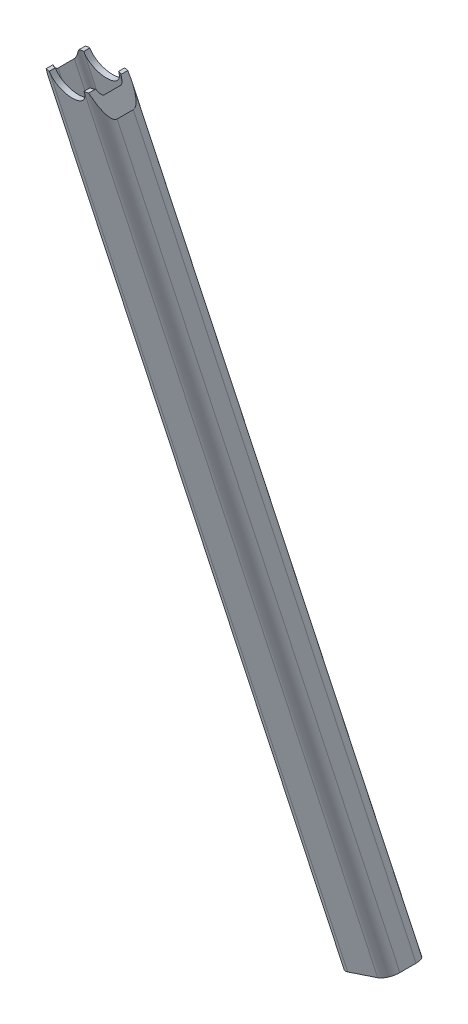
ISO-10303-21;
HEADER;
FILE_DESCRIPTION(('STEP AP214'),'2;1');
FILE_NAME('part.step','',(''),(''),'','','');
FILE_SCHEMA(('AUTOMOTIVE_DESIGN { 1 0 10303 214 1 1 1 1 }'));
ENDSEC;
DATA;
#1=APPLICATION_CONTEXT('core data for automotive mechanical design processes');
#2=APPLICATION_PROTOCOL_DEFINITION('international standard','automotive_design',2000,#1);
#3=PRODUCT_CONTEXT('',#1,'mechanical');
#4=PRODUCT('Part','Part','',(#3));
#5=PRODUCT_RELATED_PRODUCT_CATEGORY('part','',(#4));
#6=PRODUCT_DEFINITION_FORMATION('','',#4);
#7=PRODUCT_DEFINITION_CONTEXT('part definition',#1,'design');
#8=PRODUCT_DEFINITION('design','',#6,#7);
#9=PRODUCT_DEFINITION_SHAPE('','',#8);
#10=(LENGTH_UNIT() NAMED_UNIT(*) SI_UNIT(.MILLI.,.METRE.));
#11=(NAMED_UNIT(*) PLANE_ANGLE_UNIT() SI_UNIT($,.RADIAN.));
#12=(NAMED_UNIT(*) SI_UNIT($,.STERADIAN.) SOLID_ANGLE_UNIT());
#13=UNCERTAINTY_MEASURE_WITH_UNIT(LENGTH_MEASURE(1.E-05),#10,'distance_accuracy_value','');
#14=(GEOMETRIC_REPRESENTATION_CONTEXT(3) GLOBAL_UNCERTAINTY_ASSIGNED_CONTEXT((#13)) GLOBAL_UNIT_ASSIGNED_CONTEXT((#10,
#11,#12)) REPRESENTATION_CONTEXT('',''));
#15=CARTESIAN_POINT('',(0.,0.,0.));
#16=DIRECTION('',(0.,0.,1.));
#17=DIRECTION('',(1.,0.,0.));
#18=AXIS2_PLACEMENT_3D('',#15,#16,#17);
#19=CARTESIAN_POINT('',(0.,3.057033245491,-9.52126817897499));
#20=DIRECTION('',(0.,-0.305703324549102,0.952126817897504));
#21=DIRECTION('',(0.,0.952126817897504,0.305703324549102));
#22=AXIS2_PLACEMENT_3D('',#19,#20,#21);
#23=PLANE('',#22);
#24=DIRECTION('',(-1.,0.,0.));
#25=VECTOR('',#24,1.);
#26=CARTESIAN_POINT('',(0.,-12.4494519813525,-14.5));
#27=LINE('',#26,#25);
#28=CARTESIAN_POINT('',(9.00000000000001,-12.4494519813525,-14.5));
#29=VERTEX_POINT('',#28);
#30=CARTESIAN_POINT('',(-9.,-12.4494519813525,-14.5));
#31=VERTEX_POINT('',#30);
#32=EDGE_CURVE('E210',#29,#31,#27,.T.);
#33=ORIENTED_EDGE('',*,*,#32,.T.);
#34=DIRECTION('',(0.,0.952126817897504,0.305703324549102));
#35=VECTOR('',#34,1.);
#36=CARTESIAN_POINT('',(-9.,-483.960112896616,-165.889892493982));
#37=LINE('',#36,#35);
#38=CARTESIAN_POINT('',(-9.,0.,-10.5028025805239));
#39=VERTEX_POINT('',#38);
#40=EDGE_CURVE('E344',#39,#31,#37,.F.);
#41=ORIENTED_EDGE('',*,*,#40,.F.);
#42=CARTESIAN_POINT('',(0.,0.,-10.5028025805239));
#43=DIRECTION('',(0.,0.305703324549102,-0.952126817897504));
#44=DIRECTION('',(0.,-0.952126817897504,-0.305703324549102));
#45=AXIS2_PLACEMENT_3D('',#42,#43,#44);
#46=ELLIPSE('',#45,9.45252232247159,9.);
#47=CARTESIAN_POINT('',(9.,0.,-10.5028025805239));
#48=VERTEX_POINT('',#47);
#49=EDGE_CURVE('E293',#48,#39,#46,.T.);
#50=ORIENTED_EDGE('',*,*,#49,.F.);
#51=DIRECTION('',(0.,-0.952126817897504,-0.305703324549102));
#52=VECTOR('',#51,1.);
#53=CARTESIAN_POINT('',(9.,0.,-10.5028025805239));
#54=LINE('',#53,#52);
#55=EDGE_CURVE('E350',#29,#48,#54,.F.);
#56=ORIENTED_EDGE('',*,*,#55,.F.);
#57=EDGE_LOOP('',(#33,#41,#50,#56));
#58=FACE_BOUND('',#57,.T.);
#59=ADVANCED_FACE('F43',(#58),#23,.F.);
#60=DIRECTION('',(1.,0.,0.));
#61=VECTOR('',#60,1.);
#62=CARTESIAN_POINT('',(0.,-16.5,-15.8005263293399));
#63=LINE('',#62,#61);
#64=CARTESIAN_POINT('',(-9.,-16.5,-15.8005263293399));
#65=VERTEX_POINT('',#64);
#66=CARTESIAN_POINT('',(9.00000000000001,-16.5,-15.8005263293399));
#67=VERTEX_POINT('',#66);
#68=EDGE_CURVE('E203',#65,#67,#63,.T.);
#69=ORIENTED_EDGE('',*,*,#68,.T.);
#70=CARTESIAN_POINT('',(9.00000000000001,-473.772717307585,-162.618982945461));
#71=VERTEX_POINT('',#70);
#72=EDGE_CURVE('E212',#71,#67,#54,.F.);
#73=ORIENTED_EDGE('',*,*,#72,.F.);
#74=DIRECTION('',(0.913345512368731,0.387692168498585,0.124477939896055));
#75=VECTOR('',#74,1.);
#76=CARTESIAN_POINT('',(187.742025958265,-397.901228690018,-138.258607969261));
#77=LINE('',#76,#75);
#78=CARTESIAN_POINT('',(-9.00000000000004,-481.413263999358,-165.072165106852));
#79=VERTEX_POINT('',#78);
#80=EDGE_CURVE('E299',#79,#71,#77,.T.);
#81=ORIENTED_EDGE('',*,*,#80,.F.);
#82=EDGE_CURVE('E341',#65,#79,#37,.F.);
#83=ORIENTED_EDGE('',*,*,#82,.F.);
#84=EDGE_LOOP('',(#69,#73,#81,#83));
#85=FACE_BOUND('',#84,.T.);
#86=ADVANCED_FACE('F451',(#85),#23,.F.);
#87=CARTESIAN_POINT('',(9.,20.2653496561465,2.30555921939207));
#88=DIRECTION('',(0.,0.952126817897504,0.305703324549102));
#89=DIRECTION('',(0.,0.305703324549102,-0.952126817897504));
#90=AXIS2_PLACEMENT_3D('',#87,#88,#89);
#91=CYLINDRICAL_SURFACE('',#90,6.);
#92=ORIENTED_EDGE('',*,*,#55,.T.);
#93=CARTESIAN_POINT('',(9.,0.,-4.20112103220954));
#94=DIRECTION('',(0.,-1.,0.));
#95=DIRECTION('',(0.,0.,1.));
#96=AXIS2_PLACEMENT_3D('',#93,#94,#95);
#97=ELLIPSE('',#96,6.30168154831439,6.);
#98=CARTESIAN_POINT('',(10.980762113533,0.,-10.1495083750219));
#99=VERTEX_POINT('',#98);
#100=EDGE_CURVE('E312',#48,#99,#97,.T.);
#101=ORIENTED_EDGE('',*,*,#100,.T.);
#102=CARTESIAN_POINT('',(9.,7.39230484541259,-1.8276429147532));
#103=DIRECTION('',(0.965925826289066,0.258819045102528,0.));
#104=DIRECTION('',(-0.245605956195242,0.916613907162153,0.315430910784522));
#105=AXIS2_PLACEMENT_3D('',#102,#103,#104);
#106=ELLIPSE('',#105,24.347827826264,6.);
#107=CARTESIAN_POINT('',(15.,-14.9999999999999,-9.0172335311331));
#108=VERTEX_POINT('',#107);
#109=EDGE_CURVE('E371',#108,#99,#106,.T.);
#110=ORIENTED_EDGE('',*,*,#109,.F.);
#111=DIRECTION('',(0.,-0.952126817897504,-0.305703324549102));
#112=VECTOR('',#111,1.);
#113=CARTESIAN_POINT('',(15.,-473.060088357622,-156.088494650946));
#114=LINE('',#113,#112);
#115=CARTESIAN_POINT('',(15.,-471.225868410328,-155.499574010017));
#116=VERTEX_POINT('',#115);
#117=EDGE_CURVE('E340',#108,#116,#114,.T.);
#118=ORIENTED_EDGE('',*,*,#117,.T.);
#119=CARTESIAN_POINT('',(9.,-473.772717307585,-156.317301397147));
#120=DIRECTION('',(0.390731128489275,-0.92050485345244,0.));
#121=DIRECTION('',(0.711194291827604,0.301884066312843,0.634876909155039));
#122=AXIS2_PLACEMENT_3D('',#119,#120,#121);
#123=ELLIPSE('',#122,6.84589714511482,6.);
#124=EDGE_CURVE('E333',#116,#71,#123,.F.);
#125=ORIENTED_EDGE('',*,*,#124,.T.);
#126=ORIENTED_EDGE('',*,*,#72,.T.);
#127=CARTESIAN_POINT('',(9.,-16.5,-9.49884478102551));
#128=DIRECTION('',(0.,-1.,0.));
#129=DIRECTION('',(0.,0.,1.));
#130=AXIS2_PLACEMENT_3D('',#127,#128,#129);
#131=ELLIPSE('',#130,6.30168154831439,6.);
#132=CARTESIAN_POINT('',(12.6504642541504,-16.5,-14.5));
#133=VERTEX_POINT('',#132);
#134=EDGE_CURVE('E196',#133,#67,#131,.F.);
#135=ORIENTED_EDGE('',*,*,#134,.F.);
#136=CARTESIAN_POINT('',(9.,-32.0763239129866,-14.5));
#137=DIRECTION('',(0.,0.,1.));
#138=DIRECTION('',(0.,1.,0.));
#139=AXIS2_PLACEMENT_3D('',#136,#137,#138);
#140=ELLIPSE('',#139,19.6268719316341,6.);
#141=EDGE_CURVE('E202',#29,#133,#140,.F.);
#142=ORIENTED_EDGE('',*,*,#141,.F.);
#143=EDGE_LOOP('',(#92,#101,#110,#118,#125,#126,#135,#142));
#144=FACE_BOUND('',#143,.T.);
#145=ADVANCED_FACE('F211',(#144),#91,.T.);
#146=CARTESIAN_POINT('',(-9.,20.2653496561465,2.30555921939207));
#147=DIRECTION('',(0.,-0.952126817897504,-0.305703324549102));
#148=DIRECTION('',(0.,-0.305703324549102,0.952126817897504));
#149=AXIS2_PLACEMENT_3D('',#146,#147,#148);
#150=CYLINDRICAL_SURFACE('',#149,6.);
#151=CARTESIAN_POINT('',(-9.,-16.5,-9.49884478102551));
#152=DIRECTION('',(0.,-1.,0.));
#153=DIRECTION('',(0.,0.,-1.));
#154=AXIS2_PLACEMENT_3D('',#151,#152,#153);
#155=ELLIPSE('',#154,6.30168154831439,6.);
#156=CARTESIAN_POINT('',(-12.6504642541504,-16.5,-14.5));
#157=VERTEX_POINT('',#156);
#158=EDGE_CURVE('E51',#65,#157,#155,.F.);
#159=ORIENTED_EDGE('',*,*,#158,.F.);
#160=ORIENTED_EDGE('',*,*,#82,.T.);
#161=CARTESIAN_POINT('',(-9.,-481.413263999358,-158.770483558537));
#162=DIRECTION('',(0.390731128489275,-0.92050485345244,0.));
#163=DIRECTION('',(-0.711194291827604,-0.301884066312843,-0.634876909155039));
#164=AXIS2_PLACEMENT_3D('',#161,#162,#163);
#165=ELLIPSE('',#164,6.84589714511482,6.);
#166=CARTESIAN_POINT('',(-15.,-483.960112896616,-159.588210945667));
#167=VERTEX_POINT('',#166);
#168=EDGE_CURVE('E329',#79,#167,#165,.F.);
#169=ORIENTED_EDGE('',*,*,#168,.T.);
#170=DIRECTION('',(0.,0.952126817897504,0.305703324549102));
#171=VECTOR('',#170,1.);
#172=CARTESIAN_POINT('',(-15.,-1.83421994729463,-4.79004167313892));
#173=LINE('',#172,#171);
#174=CARTESIAN_POINT('',(-15.,-15.,-9.01723353113316));
#175=VERTEX_POINT('',#174);
#176=EDGE_CURVE('E325',#167,#175,#173,.T.);
#177=ORIENTED_EDGE('',*,*,#176,.T.);
#178=CARTESIAN_POINT('',(-9.,7.39230484541259,-1.8276429147532));
#179=DIRECTION('',(-0.965925826289066,0.258819045102528,0.));
#180=DIRECTION('',(-0.245605956195242,-0.916613907162153,-0.315430910784522));
#181=AXIS2_PLACEMENT_3D('',#178,#179,#180);
#182=ELLIPSE('',#181,24.347827826264,6.);
#183=CARTESIAN_POINT('',(-10.980762113533,0.,-10.1495083750219));
#184=VERTEX_POINT('',#183);
#185=EDGE_CURVE('E366',#184,#175,#182,.T.);
#186=ORIENTED_EDGE('',*,*,#185,.F.);
#187=CARTESIAN_POINT('',(-9.,0.,-4.20112103220954));
#188=DIRECTION('',(0.,-1.,0.));
#189=DIRECTION('',(0.,0.,-1.));
#190=AXIS2_PLACEMENT_3D('',#187,#188,#189);
#191=ELLIPSE('',#190,6.30168154831439,6.);
#192=EDGE_CURVE('E309',#184,#39,#191,.T.);
#193=ORIENTED_EDGE('',*,*,#192,.T.);
#194=ORIENTED_EDGE('',*,*,#40,.T.);
#195=CARTESIAN_POINT('',(-9.,-32.0763239129866,-14.5));
#196=DIRECTION('',(0.,0.,1.));
#197=DIRECTION('',(0.,-1.,0.));
#198=AXIS2_PLACEMENT_3D('',#195,#196,#197);
#199=ELLIPSE('',#198,19.6268719316341,6.);
#200=EDGE_CURVE('E11',#157,#31,#199,.F.);
#201=ORIENTED_EDGE('',*,*,#200,.F.);
#202=EDGE_LOOP('',(#159,#160,#169,#177,#186,#193,#194,#201));
#203=FACE_BOUND('',#202,.T.);
#204=ADVANCED_FACE('F448',(#203),#150,.T.);
#205=CARTESIAN_POINT('',(0.,0.,0.));
#206=DIRECTION('',(0.,1.,0.));
#207=DIRECTION('',(0.,0.,-1.));
#208=AXIS2_PLACEMENT_3D('',#205,#206,#207);
#209=PLANE('',#208);
#210=ORIENTED_EDGE('',*,*,#100,.F.);
#211=DIRECTION('',(0.,0.,-1.));
#212=VECTOR('',#211,1.);
#213=CARTESIAN_POINT('',(9.,0.,10.5028025805241));
#214=LINE('',#213,#212);
#215=CARTESIAN_POINT('',(9.00000000000001,0.,-7.35196180636674));
#216=VERTEX_POINT('',#215);
#217=EDGE_CURVE('E281',#48,#216,#214,.F.);
#218=ORIENTED_EDGE('',*,*,#217,.T.);
#219=CARTESIAN_POINT('',(9.,0.,-4.20112103220954));
#220=DIRECTION('',(0.,-1.,0.));
#221=DIRECTION('',(0.,0.,1.));
#222=AXIS2_PLACEMENT_3D('',#219,#220,#221);
#223=ELLIPSE('',#222,3.1508407741572,3.);
#224=CARTESIAN_POINT('',(10.980762113533,0.,-6.56753587915757));
#225=VERTEX_POINT('',#224);
#226=EDGE_CURVE('E250',#216,#225,#223,.T.);
#227=ORIENTED_EDGE('',*,*,#226,.T.);
#228=DIRECTION('',(0.,0.,1.));
#229=VECTOR('',#228,1.);
#230=CARTESIAN_POINT('',(10.980762113533,0.,0.));
#231=LINE('',#230,#229);
#232=EDGE_CURVE('E380',#99,#225,#231,.T.);
#233=ORIENTED_EDGE('',*,*,#232,.F.);
#234=EDGE_LOOP('',(#210,#218,#227,#233));
#235=FACE_BOUND('',#234,.T.);
#236=ADVANCED_FACE('F410',(#235),#209,.T.);
#237=CARTESIAN_POINT('',(-9.,0.,4.20112103220966));
#238=DIRECTION('',(0.,-1.,0.));
#239=DIRECTION('',(0.,0.,1.));
#240=AXIS2_PLACEMENT_3D('',#237,#238,#239);
#241=ELLIPSE('',#240,6.30168154831439,6.);
#242=CARTESIAN_POINT('',(-9.,0.,10.5028025805241));
#243=VERTEX_POINT('',#242);
#244=CARTESIAN_POINT('',(-10.980762113533,0.,10.149508375022));
#245=VERTEX_POINT('',#244);
#246=EDGE_CURVE('E316',#243,#245,#241,.T.);
#247=ORIENTED_EDGE('',*,*,#246,.F.);
#248=DIRECTION('',(0.,0.,-1.));
#249=VECTOR('',#248,1.);
#250=CARTESIAN_POINT('',(-9.,0.,10.5028025805241));
#251=LINE('',#250,#249);
#252=CARTESIAN_POINT('',(-9.00000000000002,0.,7.35196180636685));
#253=VERTEX_POINT('',#252);
#254=EDGE_CURVE('E286',#243,#253,#251,.T.);
#255=ORIENTED_EDGE('',*,*,#254,.T.);
#256=CARTESIAN_POINT('',(-9.,0.,4.20112103220966));
#257=DIRECTION('',(0.,-1.,0.));
#258=DIRECTION('',(0.,0.,1.));
#259=AXIS2_PLACEMENT_3D('',#256,#257,#258);
#260=ELLIPSE('',#259,3.1508407741572,3.);
#261=CARTESIAN_POINT('',(-10.980762113533,0.,6.56753587915769));
#262=VERTEX_POINT('',#261);
#263=EDGE_CURVE('E227',#253,#262,#260,.T.);
#264=ORIENTED_EDGE('',*,*,#263,.T.);
#265=DIRECTION('',(0.,0.,-1.));
#266=VECTOR('',#265,1.);
#267=CARTESIAN_POINT('',(-10.980762113533,0.,0.));
#268=LINE('',#267,#266);
#269=EDGE_CURVE('E358',#245,#262,#268,.T.);
#270=ORIENTED_EDGE('',*,*,#269,.F.);
#271=EDGE_LOOP('',(#247,#255,#264,#270));
#272=FACE_BOUND('',#271,.T.);
#273=ADVANCED_FACE('F440',(#272),#209,.T.);
#274=CARTESIAN_POINT('',(0.,0.,10.5028025805241));
#275=DIRECTION('',(0.,0.,-1.));
#276=DIRECTION('',(1.,0.,0.));
#277=AXIS2_PLACEMENT_3D('',#274,#275,#276);
#278=CYLINDRICAL_SURFACE('',#277,9.);
#279=CARTESIAN_POINT('',(0.,0.,7.35196180636685));
#280=DIRECTION('',(0.,0.305703324549102,-0.952126817897504));
#281=DIRECTION('',(0.,-0.952126817897504,-0.305703324549102));
#282=AXIS2_PLACEMENT_3D('',#279,#280,#281);
#283=ELLIPSE('',#282,9.45252232247159,9.);
#284=CARTESIAN_POINT('',(9.,0.,7.35196180636685));
#285=VERTEX_POINT('',#284);
#286=EDGE_CURVE('E213',#285,#253,#283,.T.);
#287=ORIENTED_EDGE('',*,*,#286,.T.);
#288=ORIENTED_EDGE('',*,*,#254,.F.);
#289=CARTESIAN_POINT('',(0.,0.,10.5028025805241));
#290=DIRECTION('',(0.,0.305703324549102,-0.952126817897504));
#291=DIRECTION('',(0.,-0.952126817897504,-0.305703324549102));
#292=AXIS2_PLACEMENT_3D('',#289,#290,#291);
#293=ELLIPSE('',#292,9.45252232247159,9.);
#294=CARTESIAN_POINT('',(9.,0.,10.5028025805241));
#295=VERTEX_POINT('',#294);
#296=EDGE_CURVE('E243',#295,#243,#293,.T.);
#297=ORIENTED_EDGE('',*,*,#296,.F.);
#298=EDGE_CURVE('E284',#285,#295,#214,.F.);
#299=ORIENTED_EDGE('',*,*,#298,.F.);
#300=EDGE_LOOP('',(#287,#288,#297,#299));
#301=FACE_BOUND('',#300,.T.);
#302=ADVANCED_FACE('F426',(#301),#278,.F.);
#303=CARTESIAN_POINT('',(-9.,0.,-4.20112103220954));
#304=DIRECTION('',(0.,-1.,0.));
#305=DIRECTION('',(0.,0.,-1.));
#306=AXIS2_PLACEMENT_3D('',#303,#304,#305);
#307=ELLIPSE('',#306,3.1508407741572,3.);
#308=CARTESIAN_POINT('',(-10.980762113533,0.,-6.56753587915757));
#309=VERTEX_POINT('',#308);
#310=CARTESIAN_POINT('',(-9.,0.,-7.35196180636674));
#311=VERTEX_POINT('',#310);
#312=EDGE_CURVE('E229',#309,#311,#307,.T.);
#313=ORIENTED_EDGE('',*,*,#312,.T.);
#314=EDGE_CURVE('E290',#311,#39,#251,.T.);
#315=ORIENTED_EDGE('',*,*,#314,.T.);
#316=ORIENTED_EDGE('',*,*,#192,.F.);
#317=DIRECTION('',(0.,0.,-1.));
#318=VECTOR('',#317,1.);
#319=CARTESIAN_POINT('',(-10.980762113533,0.,0.));
#320=LINE('',#319,#318);
#321=EDGE_CURVE('E352',#309,#184,#320,.T.);
#322=ORIENTED_EDGE('',*,*,#321,.F.);
#323=EDGE_LOOP('',(#313,#315,#316,#322));
#324=FACE_BOUND('',#323,.T.);
#325=ADVANCED_FACE('F496',(#324),#209,.T.);
#326=CARTESIAN_POINT('',(9.,0.,4.20112103220966));
#327=DIRECTION('',(0.,-1.,0.));
#328=DIRECTION('',(0.,0.,-1.));
#329=AXIS2_PLACEMENT_3D('',#326,#327,#328);
#330=ELLIPSE('',#329,3.1508407741572,3.);
#331=CARTESIAN_POINT('',(10.980762113533,0.,6.56753587915769));
#332=VERTEX_POINT('',#331);
#333=EDGE_CURVE('E251',#332,#285,#330,.T.);
#334=ORIENTED_EDGE('',*,*,#333,.T.);
#335=ORIENTED_EDGE('',*,*,#298,.T.);
#336=CARTESIAN_POINT('',(9.,0.,4.20112103220966));
#337=DIRECTION('',(0.,-1.,0.));
#338=DIRECTION('',(0.,0.,-1.));
#339=AXIS2_PLACEMENT_3D('',#336,#337,#338);
#340=ELLIPSE('',#339,6.30168154831439,6.);
#341=CARTESIAN_POINT('',(10.980762113533,0.,10.149508375022));
#342=VERTEX_POINT('',#341);
#343=EDGE_CURVE('E317',#342,#295,#340,.T.);
#344=ORIENTED_EDGE('',*,*,#343,.F.);
#345=DIRECTION('',(0.,0.,1.));
#346=VECTOR('',#345,1.);
#347=CARTESIAN_POINT('',(10.980762113533,0.,0.));
#348=LINE('',#347,#346);
#349=EDGE_CURVE('E372',#332,#342,#348,.T.);
#350=ORIENTED_EDGE('',*,*,#349,.F.);
#351=EDGE_LOOP('',(#334,#335,#344,#350));
#352=FACE_BOUND('',#351,.T.);
#353=ADVANCED_FACE('F418',(#352),#209,.T.);
#354=CARTESIAN_POINT('',(-15.,22.0995696034411,-3.40720168799301));
#355=DIRECTION('',(-1.,0.,0.));
#356=DIRECTION('',(0.,0.,-1.));
#357=AXIS2_PLACEMENT_3D('',#354,#355,#356);
#358=PLANE('',#357);
#359=ORIENTED_EDGE('',*,*,#176,.F.);
#360=DIRECTION('',(0.,0.,1.));
#361=VECTOR('',#360,1.);
#362=CARTESIAN_POINT('',(-15.,-483.960112896616,-3.40720168799301));
#363=LINE('',#362,#361);
#364=CARTESIAN_POINT('',(-15.,-483.960112896616,-151.185968881248));
#365=VERTEX_POINT('',#364);
#366=EDGE_CURVE('E298',#167,#365,#363,.T.);
#367=ORIENTED_EDGE('',*,*,#366,.T.);
#368=DIRECTION('',(0.,0.952126817897504,0.305703324549102));
#369=VECTOR('',#368,1.);
#370=CARTESIAN_POINT('',(-15.,17.8197230597537,9.92257376257209));
#371=LINE('',#370,#369);
#372=CARTESIAN_POINT('',(-15.,-15.,-0.614991466713979));
#373=VERTEX_POINT('',#372);
#374=EDGE_CURVE('E322',#373,#365,#371,.F.);
#375=ORIENTED_EDGE('',*,*,#374,.F.);
#376=DIRECTION('',(0.,0.,1.));
#377=VECTOR('',#376,1.);
#378=CARTESIAN_POINT('',(-15.,-15.,-3.40720168799301));
#379=LINE('',#378,#377);
#380=EDGE_CURVE('E346',#175,#373,#379,.T.);
#381=ORIENTED_EDGE('',*,*,#380,.F.);
#382=EDGE_LOOP('',(#359,#367,#375,#381));
#383=FACE_BOUND('',#382,.T.);
#384=ADVANCED_FACE('F447',(#383),#358,.T.);
#385=CARTESIAN_POINT('',(15.,22.0995696034411,-3.40720168799301));
#386=DIRECTION('',(1.,0.,0.));
#387=DIRECTION('',(0.,0.,1.));
#388=AXIS2_PLACEMENT_3D('',#385,#386,#387);
#389=PLANE('',#388);
#390=DIRECTION('',(0.,-0.952126817897504,-0.305703324549102));
#391=VECTOR('',#390,1.);
#392=CARTESIAN_POINT('',(15.,17.8197230597537,9.9225737625721));
#393=LINE('',#392,#391);
#394=CARTESIAN_POINT('',(15.,-471.225868410328,-147.097331945598));
#395=VERTEX_POINT('',#394);
#396=CARTESIAN_POINT('',(15.,-15.,-0.614991466713961));
#397=VERTEX_POINT('',#396);
#398=EDGE_CURVE('E338',#395,#397,#393,.F.);
#399=ORIENTED_EDGE('',*,*,#398,.F.);
#400=DIRECTION('',(0.,0.,-1.));
#401=VECTOR('',#400,1.);
#402=CARTESIAN_POINT('',(15.,-471.225868410328,-3.40720168799301));
#403=LINE('',#402,#401);
#404=EDGE_CURVE('E295',#395,#116,#403,.T.);
#405=ORIENTED_EDGE('',*,*,#404,.T.);
#406=ORIENTED_EDGE('',*,*,#117,.F.);
#407=DIRECTION('',(0.,0.,-1.));
#408=VECTOR('',#407,1.);
#409=CARTESIAN_POINT('',(15.,-15.,-3.40720168799301));
#410=LINE('',#409,#408);
#411=EDGE_CURVE('E367',#397,#108,#410,.T.);
#412=ORIENTED_EDGE('',*,*,#411,.F.);
#413=EDGE_LOOP('',(#399,#405,#406,#412));
#414=FACE_BOUND('',#413,.T.);
#415=ADVANCED_FACE('F391',(#414),#389,.T.);
#416=CARTESIAN_POINT('',(0.,-3.05703324549104,9.52126817897509));
#417=DIRECTION('',(0.,-0.305703324549102,0.952126817897504));
#418=DIRECTION('',(0.,0.952126817897504,0.305703324549102));
#419=AXIS2_PLACEMENT_3D('',#416,#417,#418);
#420=PLANE('',#419);
#421=ORIENTED_EDGE('',*,*,#296,.T.);
#422=DIRECTION('',(0.,0.952126817897504,0.305703324549102));
#423=VECTOR('',#422,1.);
#424=CARTESIAN_POINT('',(-9.,-3.05703324549104,9.52126817897509));
#425=LINE('',#424,#423);
#426=CARTESIAN_POINT('',(-9.00000000000004,-481.413263999358,-144.066559945804));
#427=VERTEX_POINT('',#426);
#428=EDGE_CURVE('E308',#427,#243,#425,.T.);
#429=ORIENTED_EDGE('',*,*,#428,.F.);
#430=DIRECTION('',(0.913345512368731,0.387692168498585,0.124477939896055));
#431=VECTOR('',#430,1.);
#432=CARTESIAN_POINT('',(185.353869976186,-398.914940761591,-117.57847956676));
#433=LINE('',#432,#431);
#434=CARTESIAN_POINT('',(8.99999999999998,-473.772717307585,-141.613377784413));
#435=VERTEX_POINT('',#434);
#436=EDGE_CURVE('E305',#427,#435,#433,.T.);
#437=ORIENTED_EDGE('',*,*,#436,.T.);
#438=DIRECTION('',(0.,-0.952126817897504,-0.305703324549102));
#439=VECTOR('',#438,1.);
#440=CARTESIAN_POINT('',(9.,-3.05703324549104,9.52126817897509));
#441=LINE('',#440,#439);
#442=EDGE_CURVE('E304',#295,#435,#441,.T.);
#443=ORIENTED_EDGE('',*,*,#442,.F.);
#444=EDGE_LOOP('',(#421,#429,#437,#443));
#445=FACE_BOUND('',#444,.T.);
#446=ADVANCED_FACE('F445',(#445),#420,.T.);
#447=CARTESIAN_POINT('',(171.775823269904,-404.678479641725,0.));
#448=DIRECTION('',(-0.390731128489275,0.92050485345244,0.));
#449=DIRECTION('',(-0.92050485345244,-0.390731128489275,0.));
#450=AXIS2_PLACEMENT_3D('',#447,#448,#449);
#451=PLANE('',#450);
#452=DIRECTION('',(0.,0.,1.));
#453=VECTOR('',#452,1.);
#454=CARTESIAN_POINT('',(-12.,-482.686688447987,-3.40720168799301));
#455=LINE('',#454,#453);
#456=CARTESIAN_POINT('',(-12.,-482.686688447987,-159.179347252102));
#457=VERTEX_POINT('',#456);
#458=CARTESIAN_POINT('',(-12.,-482.686688447987,-150.777105187683));
#459=VERTEX_POINT('',#458);
#460=EDGE_CURVE('E262',#457,#459,#455,.T.);
#461=ORIENTED_EDGE('',*,*,#460,.T.);
#462=CARTESIAN_POINT('',(-9.,-481.413263999358,-150.368241494118));
#463=DIRECTION('',(0.390731128489275,-0.92050485345244,0.));
#464=DIRECTION('',(0.711194291827604,0.301884066312843,0.634876909155039));
#465=AXIS2_PLACEMENT_3D('',#462,#463,#464);
#466=ELLIPSE('',#465,3.42294857255741,3.);
#467=CARTESIAN_POINT('',(-9.00000000000004,-481.413263999358,-147.217400719961));
#468=VERTEX_POINT('',#467);
#469=EDGE_CURVE('E239',#459,#468,#466,.F.);
#470=ORIENTED_EDGE('',*,*,#469,.T.);
#471=DIRECTION('',(0.913345512368731,0.387692168498585,0.124477939896055));
#472=VECTOR('',#471,1.);
#473=CARTESIAN_POINT('',(185.712093373498,-398.762883950855,-120.680498827136));
#474=LINE('',#473,#472);
#475=CARTESIAN_POINT('',(9.,-473.772717307585,-144.764218558571));
#476=VERTEX_POINT('',#475);
#477=EDGE_CURVE('E231',#468,#476,#474,.T.);
#478=ORIENTED_EDGE('',*,*,#477,.T.);
#479=CARTESIAN_POINT('',(9.,-473.772717307585,-147.915059332728));
#480=DIRECTION('',(0.390731128489275,-0.92050485345244,0.));
#481=DIRECTION('',(-0.711194291827604,-0.301884066312843,-0.634876909155039));
#482=AXIS2_PLACEMENT_3D('',#479,#480,#481);
#483=ELLIPSE('',#482,3.42294857255741,3.);
#484=CARTESIAN_POINT('',(12.,-472.499292858956,-147.506195639163));
#485=VERTEX_POINT('',#484);
#486=EDGE_CURVE('E270',#476,#485,#483,.F.);
#487=ORIENTED_EDGE('',*,*,#486,.T.);
#488=DIRECTION('',(0.,0.,-1.));
#489=VECTOR('',#488,1.);
#490=CARTESIAN_POINT('',(12.,-472.499292858956,-3.40720168799301));
#491=LINE('',#490,#489);
#492=CARTESIAN_POINT('',(12.,-472.499292858956,-155.908437703582));
#493=VERTEX_POINT('',#492);
#494=EDGE_CURVE('E252',#485,#493,#491,.T.);
#495=ORIENTED_EDGE('',*,*,#494,.T.);
#496=CARTESIAN_POINT('',(9.,-473.772717307585,-156.317301397147));
#497=DIRECTION('',(0.390731128489275,-0.92050485345244,0.));
#498=DIRECTION('',(0.711194291827604,0.301884066312843,0.634876909155039));
#499=AXIS2_PLACEMENT_3D('',#496,#497,#498);
#500=ELLIPSE('',#499,3.42294857255741,3.);
#501=CARTESIAN_POINT('',(9.00000000000001,-473.772717307585,-159.468142171304));
#502=VERTEX_POINT('',#501);
#503=EDGE_CURVE('E275',#493,#502,#500,.F.);
#504=ORIENTED_EDGE('',*,*,#503,.T.);
#505=DIRECTION('',(0.913345512368731,0.387692168498585,0.124477939896055));
#506=VECTOR('',#505,1.);
#507=CARTESIAN_POINT('',(187.383802560953,-398.053285500754,-135.156588708886));
#508=LINE('',#507,#506);
#509=CARTESIAN_POINT('',(-9.,-481.413263999358,-161.921324332695));
#510=VERTEX_POINT('',#509);
#511=EDGE_CURVE('E261',#510,#502,#508,.T.);
#512=ORIENTED_EDGE('',*,*,#511,.F.);
#513=CARTESIAN_POINT('',(-9.,-481.413263999358,-158.770483558537));
#514=DIRECTION('',(0.390731128489275,-0.92050485345244,0.));
#515=DIRECTION('',(-0.711194291827604,-0.301884066312843,-0.634876909155039));
#516=AXIS2_PLACEMENT_3D('',#513,#514,#515);
#517=ELLIPSE('',#516,3.42294857255741,3.);
#518=EDGE_CURVE('E221',#510,#457,#517,.F.);
#519=ORIENTED_EDGE('',*,*,#518,.T.);
#520=EDGE_LOOP('',(#461,#470,#478,#487,#495,#504,#512,#519));
#521=FACE_BOUND('',#520,.T.);
#522=ORIENTED_EDGE('',*,*,#366,.F.);
#523=ORIENTED_EDGE('',*,*,#168,.F.);
#524=ORIENTED_EDGE('',*,*,#80,.T.);
#525=ORIENTED_EDGE('',*,*,#124,.F.);
#526=ORIENTED_EDGE('',*,*,#404,.F.);
#527=CARTESIAN_POINT('',(9.,-473.772717307585,-147.915059332728));
#528=DIRECTION('',(0.390731128489275,-0.92050485345244,0.));
#529=DIRECTION('',(-0.711194291827604,-0.301884066312843,-0.634876909155039));
#530=AXIS2_PLACEMENT_3D('',#527,#528,#529);
#531=ELLIPSE('',#530,6.84589714511482,6.);
#532=EDGE_CURVE('E331',#435,#395,#531,.F.);
#533=ORIENTED_EDGE('',*,*,#532,.F.);
#534=ORIENTED_EDGE('',*,*,#436,.F.);
#535=CARTESIAN_POINT('',(-9.,-481.413263999358,-150.368241494118));
#536=DIRECTION('',(0.390731128489275,-0.92050485345244,0.));
#537=DIRECTION('',(0.711194291827604,0.301884066312843,0.634876909155039));
#538=AXIS2_PLACEMENT_3D('',#535,#536,#537);
#539=ELLIPSE('',#538,6.84589714511482,6.);
#540=EDGE_CURVE('E334',#365,#427,#539,.F.);
#541=ORIENTED_EDGE('',*,*,#540,.F.);
#542=EDGE_LOOP('',(#522,#523,#524,#525,#526,#533,#534,#541));
#543=FACE_BOUND('',#542,.T.);
#544=ADVANCED_FACE('F402',(#521,#543),#451,.F.);
#545=CARTESIAN_POINT('',(-9.,-1.22281329819642,3.80850727159007));
#546=DIRECTION('',(0.,0.952126817897504,0.305703324549102));
#547=DIRECTION('',(0.,0.305703324549102,-0.952126817897504));
#548=AXIS2_PLACEMENT_3D('',#545,#546,#547);
#549=CYLINDRICAL_SURFACE('',#548,6.);
#550=ORIENTED_EDGE('',*,*,#374,.T.);
#551=ORIENTED_EDGE('',*,*,#540,.T.);
#552=ORIENTED_EDGE('',*,*,#428,.T.);
#553=ORIENTED_EDGE('',*,*,#246,.T.);
#554=CARTESIAN_POINT('',(-9.,7.39230484541259,6.574599149666));
#555=DIRECTION('',(-0.965925826289066,0.258819045102528,0.));
#556=DIRECTION('',(0.245605956195242,0.916613907162153,0.315430910784522));
#557=AXIS2_PLACEMENT_3D('',#554,#555,#556);
#558=ELLIPSE('',#557,24.347827826264,6.);
#559=EDGE_CURVE('E355',#373,#245,#558,.T.);
#560=ORIENTED_EDGE('',*,*,#559,.F.);
#561=EDGE_LOOP('',(#550,#551,#552,#553,#560));
#562=FACE_BOUND('',#561,.T.);
#563=ADVANCED_FACE('F437',(#562),#549,.T.);
#564=CARTESIAN_POINT('',(9.,-1.22281329819642,3.80850727159007));
#565=DIRECTION('',(0.,-0.952126817897504,-0.305703324549102));
#566=DIRECTION('',(0.,-0.305703324549102,0.952126817897504));
#567=AXIS2_PLACEMENT_3D('',#564,#565,#566);
#568=CYLINDRICAL_SURFACE('',#567,6.);
#569=ORIENTED_EDGE('',*,*,#343,.T.);
#570=ORIENTED_EDGE('',*,*,#442,.T.);
#571=ORIENTED_EDGE('',*,*,#532,.T.);
#572=ORIENTED_EDGE('',*,*,#398,.T.);
#573=CARTESIAN_POINT('',(9.,7.39230484541259,6.574599149666));
#574=DIRECTION('',(0.965925826289066,0.258819045102528,0.));
#575=DIRECTION('',(0.245605956195242,-0.916613907162153,-0.315430910784522));
#576=AXIS2_PLACEMENT_3D('',#573,#574,#575);
#577=ELLIPSE('',#576,24.347827826264,6.);
#578=EDGE_CURVE('E383',#342,#397,#577,.T.);
#579=ORIENTED_EDGE('',*,*,#578,.F.);
#580=EDGE_LOOP('',(#569,#570,#571,#572,#579));
#581=FACE_BOUND('',#580,.T.);
#582=ADVANCED_FACE('F398',(#581),#568,.T.);
#583=ORIENTED_EDGE('',*,*,#217,.F.);
#584=ORIENTED_EDGE('',*,*,#49,.T.);
#585=ORIENTED_EDGE('',*,*,#314,.F.);
#586=CARTESIAN_POINT('',(0.,0.,-7.35196180636674));
#587=DIRECTION('',(0.,0.305703324549102,-0.952126817897504));
#588=DIRECTION('',(0.,-0.952126817897504,-0.305703324549102));
#589=AXIS2_PLACEMENT_3D('',#586,#587,#588);
#590=ELLIPSE('',#589,9.45252232247159,9.);
#591=EDGE_CURVE('E247',#216,#311,#590,.T.);
#592=ORIENTED_EDGE('',*,*,#591,.F.);
#593=EDGE_LOOP('',(#583,#584,#585,#592));
#594=FACE_BOUND('',#593,.T.);
#595=ADVANCED_FACE('F475',(#594),#278,.F.);
#596=CARTESIAN_POINT('',(-12.,22.0995696034411,-3.40720168799301));
#597=DIRECTION('',(-1.,0.,0.));
#598=DIRECTION('',(0.,0.,-1.));
#599=AXIS2_PLACEMENT_3D('',#596,#597,#598);
#600=PLANE('',#599);
#601=DIRECTION('',(0.,0.952126817897504,0.305703324549102));
#602=VECTOR('',#601,1.);
#603=CARTESIAN_POINT('',(-12.,-1.22281329819642,3.80850727159006));
#604=LINE('',#603,#602);
#605=CARTESIAN_POINT('',(-12.,-3.80384757729372,2.979803841476));
#606=VERTEX_POINT('',#605);
#607=EDGE_CURVE('E223',#606,#459,#604,.F.);
#608=ORIENTED_EDGE('',*,*,#607,.T.);
#609=ORIENTED_EDGE('',*,*,#460,.F.);
#610=DIRECTION('',(0.,-0.952126817897504,-0.305703324549102));
#611=VECTOR('',#610,1.);
#612=CARTESIAN_POINT('',(-12.,20.2653496561465,2.30555921939206));
#613=LINE('',#612,#611);
#614=CARTESIAN_POINT('',(-12.,-3.80384757729373,-5.42243822294319));
#615=VERTEX_POINT('',#614);
#616=EDGE_CURVE('E222',#457,#615,#613,.F.);
#617=ORIENTED_EDGE('',*,*,#616,.T.);
#618=DIRECTION('',(0.,0.,1.));
#619=VECTOR('',#618,1.);
#620=CARTESIAN_POINT('',(-12.,-3.80384757729372,-3.40720168799301));
#621=LINE('',#620,#619);
#622=EDGE_CURVE('E363',#606,#615,#621,.F.);
#623=ORIENTED_EDGE('',*,*,#622,.F.);
#624=EDGE_LOOP('',(#608,#609,#617,#623));
#625=FACE_BOUND('',#624,.T.);
#626=ADVANCED_FACE('F487',(#625),#600,.F.);
#627=CARTESIAN_POINT('',(12.,22.0995696034411,-3.40720168799301));
#628=DIRECTION('',(1.,0.,0.));
#629=DIRECTION('',(0.,0.,1.));
#630=AXIS2_PLACEMENT_3D('',#627,#628,#629);
#631=PLANE('',#630);
#632=DIRECTION('',(0.,0.952126817897504,0.305703324549102));
#633=VECTOR('',#632,1.);
#634=CARTESIAN_POINT('',(12.,20.2653496561465,2.30555921939208));
#635=LINE('',#634,#633);
#636=CARTESIAN_POINT('',(12.,-3.80384757729373,-5.42243822294317));
#637=VERTEX_POINT('',#636);
#638=EDGE_CURVE('E238',#637,#493,#635,.F.);
#639=ORIENTED_EDGE('',*,*,#638,.T.);
#640=ORIENTED_EDGE('',*,*,#494,.F.);
#641=DIRECTION('',(0.,-0.952126817897504,-0.305703324549102));
#642=VECTOR('',#641,1.);
#643=CARTESIAN_POINT('',(12.,-1.22281329819642,3.80850727159007));
#644=LINE('',#643,#642);
#645=CARTESIAN_POINT('',(12.,-3.80384757729372,2.97980384147602));
#646=VERTEX_POINT('',#645);
#647=EDGE_CURVE('E234',#485,#646,#644,.F.);
#648=ORIENTED_EDGE('',*,*,#647,.T.);
#649=DIRECTION('',(0.,0.,-1.));
#650=VECTOR('',#649,1.);
#651=CARTESIAN_POINT('',(12.,-3.80384757729372,-3.40720168799301));
#652=LINE('',#651,#650);
#653=EDGE_CURVE('E385',#637,#646,#652,.F.);
#654=ORIENTED_EDGE('',*,*,#653,.F.);
#655=EDGE_LOOP('',(#639,#640,#648,#654));
#656=FACE_BOUND('',#655,.T.);
#657=ADVANCED_FACE('F411',(#656),#631,.F.);
#658=CARTESIAN_POINT('',(0.,2.1399232718437,-6.66488772528248));
#659=DIRECTION('',(0.,-0.305703324549102,0.952126817897504));
#660=DIRECTION('',(0.,0.952126817897504,0.305703324549102));
#661=AXIS2_PLACEMENT_3D('',#658,#659,#660);
#662=PLANE('',#661);
#663=DIRECTION('',(0.,0.952126817897504,0.305703324549102));
#664=VECTOR('',#663,1.);
#665=CARTESIAN_POINT('',(9.00000000000001,2.1399232718437,-6.66488772528248));
#666=LINE('',#665,#664);
#667=EDGE_CURVE('E241',#502,#216,#666,.T.);
#668=ORIENTED_EDGE('',*,*,#667,.T.);
#669=ORIENTED_EDGE('',*,*,#591,.T.);
#670=DIRECTION('',(0.,0.952126817897504,0.305703324549102));
#671=VECTOR('',#670,1.);
#672=CARTESIAN_POINT('',(-9.,2.1399232718437,-6.66488772528248));
#673=LINE('',#672,#671);
#674=EDGE_CURVE('E240',#311,#510,#673,.F.);
#675=ORIENTED_EDGE('',*,*,#674,.T.);
#676=ORIENTED_EDGE('',*,*,#511,.T.);
#677=EDGE_LOOP('',(#668,#669,#675,#676));
#678=FACE_BOUND('',#677,.T.);
#679=ADVANCED_FACE('F503',(#678),#662,.T.);
#680=CARTESIAN_POINT('',(0.,-2.13992327184373,6.66488772528258));
#681=DIRECTION('',(0.,-0.305703324549102,0.952126817897504));
#682=DIRECTION('',(0.,0.952126817897504,0.305703324549102));
#683=AXIS2_PLACEMENT_3D('',#680,#681,#682);
#684=PLANE('',#683);
#685=ORIENTED_EDGE('',*,*,#286,.F.);
#686=DIRECTION('',(0.,0.952126817897504,0.305703324549102));
#687=VECTOR('',#686,1.);
#688=CARTESIAN_POINT('',(9.,-2.13992327184373,6.66488772528258));
#689=LINE('',#688,#687);
#690=EDGE_CURVE('E233',#285,#476,#689,.F.);
#691=ORIENTED_EDGE('',*,*,#690,.T.);
#692=ORIENTED_EDGE('',*,*,#477,.F.);
#693=DIRECTION('',(0.,0.952126817897504,0.305703324549102));
#694=VECTOR('',#693,1.);
#695=CARTESIAN_POINT('',(-9.00000000000004,-2.13992327184373,6.66488772528258));
#696=LINE('',#695,#694);
#697=EDGE_CURVE('E226',#468,#253,#696,.T.);
#698=ORIENTED_EDGE('',*,*,#697,.T.);
#699=EDGE_LOOP('',(#685,#691,#692,#698));
#700=FACE_BOUND('',#699,.T.);
#701=ADVANCED_FACE('F425',(#700),#684,.F.);
#702=CARTESIAN_POINT('',(-9.,-1.22281329819642,3.80850727159007));
#703=DIRECTION('',(0.,0.952126817897504,0.305703324549102));
#704=DIRECTION('',(0.,0.305703324549102,-0.952126817897504));
#705=AXIS2_PLACEMENT_3D('',#702,#703,#704);
#706=CYLINDRICAL_SURFACE('',#705,3.);
#707=ORIENTED_EDGE('',*,*,#263,.F.);
#708=ORIENTED_EDGE('',*,*,#697,.F.);
#709=ORIENTED_EDGE('',*,*,#469,.F.);
#710=ORIENTED_EDGE('',*,*,#607,.F.);
#711=CARTESIAN_POINT('',(-9.,7.39230484541259,6.574599149666));
#712=DIRECTION('',(-0.965925826289066,0.258819045102528,0.));
#713=DIRECTION('',(0.245605956195242,0.916613907162153,0.315430910784522));
#714=AXIS2_PLACEMENT_3D('',#711,#712,#713);
#715=ELLIPSE('',#714,12.173913913132,3.);
#716=EDGE_CURVE('E360',#262,#606,#715,.F.);
#717=ORIENTED_EDGE('',*,*,#716,.F.);
#718=EDGE_LOOP('',(#707,#708,#709,#710,#717));
#719=FACE_BOUND('',#718,.T.);
#720=ADVANCED_FACE('F435',(#719),#706,.F.);
#721=CARTESIAN_POINT('',(9.,-1.22281329819642,3.80850727159007));
#722=DIRECTION('',(0.,-0.952126817897504,-0.305703324549102));
#723=DIRECTION('',(0.,-0.305703324549102,0.952126817897504));
#724=AXIS2_PLACEMENT_3D('',#721,#722,#723);
#725=CYLINDRICAL_SURFACE('',#724,3.);
#726=ORIENTED_EDGE('',*,*,#647,.F.);
#727=ORIENTED_EDGE('',*,*,#486,.F.);
#728=ORIENTED_EDGE('',*,*,#690,.F.);
#729=ORIENTED_EDGE('',*,*,#333,.F.);
#730=CARTESIAN_POINT('',(9.,7.39230484541259,6.574599149666));
#731=DIRECTION('',(0.965925826289066,0.258819045102528,0.));
#732=DIRECTION('',(0.245605956195242,-0.916613907162153,-0.315430910784522));
#733=AXIS2_PLACEMENT_3D('',#730,#731,#732);
#734=ELLIPSE('',#733,12.173913913132,3.);
#735=EDGE_CURVE('E62',#646,#332,#734,.F.);
#736=ORIENTED_EDGE('',*,*,#735,.F.);
#737=EDGE_LOOP('',(#726,#727,#728,#729,#736));
#738=FACE_BOUND('',#737,.T.);
#739=ADVANCED_FACE('F417',(#738),#725,.F.);
#740=CARTESIAN_POINT('',(9.,20.2653496561465,2.30555921939207));
#741=DIRECTION('',(0.,0.952126817897504,0.305703324549102));
#742=DIRECTION('',(0.,0.305703324549102,-0.952126817897504));
#743=AXIS2_PLACEMENT_3D('',#740,#741,#742);
#744=CYLINDRICAL_SURFACE('',#743,3.);
#745=ORIENTED_EDGE('',*,*,#226,.F.);
#746=ORIENTED_EDGE('',*,*,#667,.F.);
#747=ORIENTED_EDGE('',*,*,#503,.F.);
#748=ORIENTED_EDGE('',*,*,#638,.F.);
#749=CARTESIAN_POINT('',(9.,7.39230484541259,-1.8276429147532));
#750=DIRECTION('',(0.965925826289066,0.258819045102528,0.));
#751=DIRECTION('',(-0.245605956195242,0.916613907162153,0.315430910784522));
#752=AXIS2_PLACEMENT_3D('',#749,#750,#751);
#753=ELLIPSE('',#752,12.173913913132,3.);
#754=EDGE_CURVE('E379',#225,#637,#753,.F.);
#755=ORIENTED_EDGE('',*,*,#754,.F.);
#756=EDGE_LOOP('',(#745,#746,#747,#748,#755));
#757=FACE_BOUND('',#756,.T.);
#758=ADVANCED_FACE('F409',(#757),#744,.F.);
#759=CARTESIAN_POINT('',(-9.,20.2653496561465,2.30555921939207));
#760=DIRECTION('',(0.,-0.952126817897504,-0.305703324549102));
#761=DIRECTION('',(0.,-0.305703324549102,0.952126817897504));
#762=AXIS2_PLACEMENT_3D('',#759,#760,#761);
#763=CYLINDRICAL_SURFACE('',#762,3.);
#764=ORIENTED_EDGE('',*,*,#616,.F.);
#765=ORIENTED_EDGE('',*,*,#518,.F.);
#766=ORIENTED_EDGE('',*,*,#674,.F.);
#767=ORIENTED_EDGE('',*,*,#312,.F.);
#768=CARTESIAN_POINT('',(-9.,7.39230484541259,-1.8276429147532));
#769=DIRECTION('',(-0.965925826289066,0.258819045102528,0.));
#770=DIRECTION('',(-0.245605956195242,-0.916613907162153,-0.315430910784522));
#771=AXIS2_PLACEMENT_3D('',#768,#769,#770);
#772=ELLIPSE('',#771,12.173913913132,3.);
#773=EDGE_CURVE('E364',#615,#309,#772,.F.);
#774=ORIENTED_EDGE('',*,*,#773,.F.);
#775=EDGE_LOOP('',(#764,#765,#766,#767,#774));
#776=FACE_BOUND('',#775,.T.);
#777=ADVANCED_FACE('F480',(#776),#763,.F.);
#778=CARTESIAN_POINT('',(-15.,-15.,-3.40720168799301));
#779=DIRECTION('',(0.965925826289066,-0.258819045102528,0.));
#780=DIRECTION('',(0.,0.,1.));
#781=AXIS2_PLACEMENT_3D('',#778,#779,#780);
#782=PLANE('',#781);
#783=ORIENTED_EDGE('',*,*,#716,.T.);
#784=ORIENTED_EDGE('',*,*,#622,.T.);
#785=ORIENTED_EDGE('',*,*,#773,.T.);
#786=ORIENTED_EDGE('',*,*,#321,.T.);
#787=ORIENTED_EDGE('',*,*,#185,.T.);
#788=ORIENTED_EDGE('',*,*,#380,.T.);
#789=ORIENTED_EDGE('',*,*,#559,.T.);
#790=ORIENTED_EDGE('',*,*,#269,.T.);
#791=EDGE_LOOP('',(#783,#784,#785,#786,#787,#788,#789,#790));
#792=FACE_BOUND('',#791,.T.);
#793=ADVANCED_FACE('F472',(#792),#782,.F.);
#794=CARTESIAN_POINT('',(15.,-15.,-3.40720168799301));
#795=DIRECTION('',(-0.965925826289066,-0.258819045102528,0.));
#796=DIRECTION('',(0.,0.,-1.));
#797=AXIS2_PLACEMENT_3D('',#794,#795,#796);
#798=PLANE('',#797);
#799=ORIENTED_EDGE('',*,*,#754,.T.);
#800=ORIENTED_EDGE('',*,*,#653,.T.);
#801=ORIENTED_EDGE('',*,*,#735,.T.);
#802=ORIENTED_EDGE('',*,*,#349,.T.);
#803=ORIENTED_EDGE('',*,*,#578,.T.);
#804=ORIENTED_EDGE('',*,*,#411,.T.);
#805=ORIENTED_EDGE('',*,*,#109,.T.);
#806=ORIENTED_EDGE('',*,*,#232,.T.);
#807=EDGE_LOOP('',(#799,#800,#801,#802,#803,#804,#805,#806));
#808=FACE_BOUND('',#807,.T.);
#809=ADVANCED_FACE('F44',(#808),#798,.F.);
#810=CARTESIAN_POINT('',(20.,-16.5,-14.5));
#811=DIRECTION('',(0.,0.,-1.));
#812=DIRECTION('',(1.,0.,0.));
#813=AXIS2_PLACEMENT_3D('',#810,#811,#812);
#814=PLANE('',#813);
#815=ORIENTED_EDGE('',*,*,#32,.F.);
#816=ORIENTED_EDGE('',*,*,#141,.T.);
#817=DIRECTION('',(-1.,0.,0.));
#818=VECTOR('',#817,1.);
#819=CARTESIAN_POINT('',(20.,-16.5,-14.5));
#820=LINE('',#819,#818);
#821=EDGE_CURVE('E60',#133,#157,#820,.T.);
#822=ORIENTED_EDGE('',*,*,#821,.T.);
#823=ORIENTED_EDGE('',*,*,#200,.T.);
#824=EDGE_LOOP('',(#815,#816,#822,#823));
#825=FACE_BOUND('',#824,.T.);
#826=ADVANCED_FACE('F204',(#825),#814,.T.);
#827=CARTESIAN_POINT('',(20.,-16.5,-14.5));
#828=DIRECTION('',(0.,1.,0.));
#829=DIRECTION('',(0.,0.,-1.));
#830=AXIS2_PLACEMENT_3D('',#827,#828,#829);
#831=PLANE('',#830);
#832=ORIENTED_EDGE('',*,*,#821,.F.);
#833=ORIENTED_EDGE('',*,*,#134,.T.);
#834=ORIENTED_EDGE('',*,*,#68,.F.);
#835=ORIENTED_EDGE('',*,*,#158,.T.);
#836=EDGE_LOOP('',(#832,#833,#834,#835));
#837=FACE_BOUND('',#836,.T.);
#838=ADVANCED_FACE('F197',(#837),#831,.T.);
#839=CLOSED_SHELL('',(#59,#86,#145,#204,#236,#273,#302,#325,#353,#384,#415,#446,#544,#563,#582,
#595,#626,#657,#679,#701,#720,#739,#758,#777,#793,#809,#826,#838));
#840=MANIFOLD_SOLID_BREP('B2',#839);
#841=ADVANCED_BREP_SHAPE_REPRESENTATION('',(#18,#840),#14);
#842=SHAPE_DEFINITION_REPRESENTATION(#9,#841);
ENDSEC;
END-ISO-10303-21;
